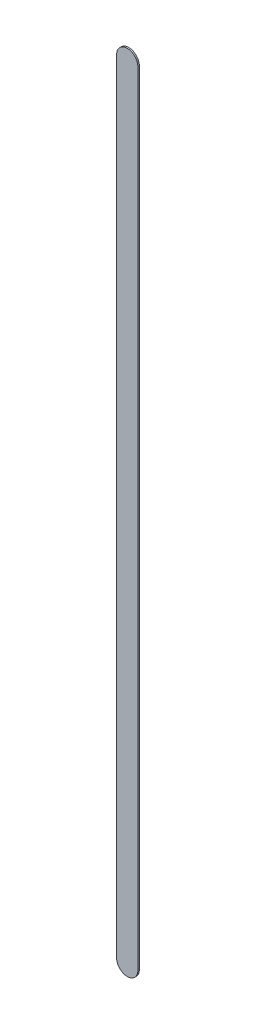
ISO-10303-21;
HEADER;
FILE_DESCRIPTION(('STEP AP214'),'2;1');
FILE_NAME('part.step','',(''),(''),'','','');
FILE_SCHEMA(('AUTOMOTIVE_DESIGN { 1 0 10303 214 1 1 1 1 }'));
ENDSEC;
DATA;
#1=APPLICATION_CONTEXT('core data for automotive mechanical design processes');
#2=APPLICATION_PROTOCOL_DEFINITION('international standard','automotive_design',2000,#1);
#3=PRODUCT_CONTEXT('',#1,'mechanical');
#4=PRODUCT('Part','Part','',(#3));
#5=PRODUCT_RELATED_PRODUCT_CATEGORY('part','',(#4));
#6=PRODUCT_DEFINITION_FORMATION('','',#4);
#7=PRODUCT_DEFINITION_CONTEXT('part definition',#1,'design');
#8=PRODUCT_DEFINITION('design','',#6,#7);
#9=PRODUCT_DEFINITION_SHAPE('','',#8);
#10=(LENGTH_UNIT() NAMED_UNIT(*) SI_UNIT(.MILLI.,.METRE.));
#11=(NAMED_UNIT(*) PLANE_ANGLE_UNIT() SI_UNIT($,.RADIAN.));
#12=(NAMED_UNIT(*) SI_UNIT($,.STERADIAN.) SOLID_ANGLE_UNIT());
#13=UNCERTAINTY_MEASURE_WITH_UNIT(LENGTH_MEASURE(1.E-05),#10,'distance_accuracy_value','');
#14=(GEOMETRIC_REPRESENTATION_CONTEXT(3) GLOBAL_UNCERTAINTY_ASSIGNED_CONTEXT((#13)) GLOBAL_UNIT_ASSIGNED_CONTEXT((#10,
#11,#12)) REPRESENTATION_CONTEXT('',''));
#15=CARTESIAN_POINT('',(0.,0.,0.));
#16=DIRECTION('',(0.,0.,1.));
#17=DIRECTION('',(1.,0.,0.));
#18=AXIS2_PLACEMENT_3D('',#15,#16,#17);
#19=CARTESIAN_POINT('',(63.9528947,82.2634372,0.));
#20=DIRECTION('',(-1.,0.,0.));
#21=DIRECTION('',(0.,1.,0.));
#22=AXIS2_PLACEMENT_3D('',#19,#20,#21);
#23=PLANE('',#22);
#24=DIRECTION('',(0.,1.,0.));
#25=VECTOR('',#24,1.);
#26=CARTESIAN_POINT('',(63.9528947,82.2634372,0.03556));
#27=LINE('',#26,#25);
#28=CARTESIAN_POINT('',(63.9528947,82.2634372,0.03556));
#29=VERTEX_POINT('',#28);
#30=CARTESIAN_POINT('',(63.9528947,100.6970808,0.03556));
#31=VERTEX_POINT('',#30);
#32=EDGE_CURVE('E11',#29,#31,#27,.T.);
#33=ORIENTED_EDGE('',*,*,#32,.F.);
#34=DIRECTION('',(0.,0.,1.));
#35=VECTOR('',#34,1.);
#36=CARTESIAN_POINT('',(63.9528947,82.2634372,0.));
#37=LINE('',#36,#35);
#38=CARTESIAN_POINT('',(63.9528947,82.2634372,0.));
#39=VERTEX_POINT('',#38);
#40=EDGE_CURVE('E24',#39,#29,#37,.T.);
#41=ORIENTED_EDGE('',*,*,#40,.F.);
#42=DIRECTION('',(0.,1.,0.));
#43=VECTOR('',#42,1.);
#44=CARTESIAN_POINT('',(63.9528947,82.2634372,0.));
#45=LINE('',#44,#43);
#46=CARTESIAN_POINT('',(63.9528947,100.6970808,0.));
#47=VERTEX_POINT('',#46);
#48=EDGE_CURVE('E75',#39,#47,#45,.T.);
#49=ORIENTED_EDGE('',*,*,#48,.T.);
#50=DIRECTION('',(0.,0.,1.));
#51=VECTOR('',#50,1.);
#52=CARTESIAN_POINT('',(63.9528947,100.6970808,0.));
#53=LINE('',#52,#51);
#54=EDGE_CURVE('E37',#47,#31,#53,.T.);
#55=ORIENTED_EDGE('',*,*,#54,.T.);
#56=EDGE_LOOP('',(#33,#41,#49,#55));
#57=FACE_BOUND('',#56,.T.);
#58=ADVANCED_FACE('F17',(#57),#23,.F.);
#59=CARTESIAN_POINT('',(63.7028952,100.6970808,0.));
#60=DIRECTION('',(0.,0.,-1.));
#61=DIRECTION('',(1.,0.,0.));
#62=AXIS2_PLACEMENT_3D('',#59,#60,#61);
#63=CYLINDRICAL_SURFACE('',#62,0.249999500000001);
#64=CARTESIAN_POINT('',(63.7028952,100.6970808,0.03556));
#65=DIRECTION('',(0.,0.,1.));
#66=DIRECTION('',(1.,0.,0.));
#67=AXIS2_PLACEMENT_3D('',#64,#65,#66);
#68=CIRCLE('',#67,0.249999500000001);
#69=CARTESIAN_POINT('',(63.4528957,100.6970808,0.03556));
#70=VERTEX_POINT('',#69);
#71=EDGE_CURVE('E83',#31,#70,#68,.T.);
#72=ORIENTED_EDGE('',*,*,#71,.F.);
#73=ORIENTED_EDGE('',*,*,#54,.F.);
#74=CARTESIAN_POINT('',(63.7028952,100.6970808,0.));
#75=DIRECTION('',(0.,0.,1.));
#76=DIRECTION('',(1.,0.,0.));
#77=AXIS2_PLACEMENT_3D('',#74,#75,#76);
#78=CIRCLE('',#77,0.249999500000001);
#79=CARTESIAN_POINT('',(63.4528957,100.6970808,0.));
#80=VERTEX_POINT('',#79);
#81=EDGE_CURVE('E81',#47,#80,#78,.T.);
#82=ORIENTED_EDGE('',*,*,#81,.T.);
#83=DIRECTION('',(0.,0.,1.));
#84=VECTOR('',#83,1.);
#85=CARTESIAN_POINT('',(63.4528957,100.6970808,0.));
#86=LINE('',#85,#84);
#87=EDGE_CURVE('E67',#80,#70,#86,.T.);
#88=ORIENTED_EDGE('',*,*,#87,.T.);
#89=EDGE_LOOP('',(#72,#73,#82,#88));
#90=FACE_BOUND('',#89,.T.);
#91=ADVANCED_FACE('F89',(#90),#63,.T.);
#92=CARTESIAN_POINT('',(63.4528957,100.6970808,0.));
#93=DIRECTION('',(1.,0.,0.));
#94=DIRECTION('',(0.,-1.,0.));
#95=AXIS2_PLACEMENT_3D('',#92,#93,#94);
#96=PLANE('',#95);
#97=DIRECTION('',(0.,-1.,0.));
#98=VECTOR('',#97,1.);
#99=CARTESIAN_POINT('',(63.4528957,100.6970808,0.03556));
#100=LINE('',#99,#98);
#101=CARTESIAN_POINT('',(63.4528957,82.2634372,0.03556));
#102=VERTEX_POINT('',#101);
#103=EDGE_CURVE('E71',#70,#102,#100,.T.);
#104=ORIENTED_EDGE('',*,*,#103,.F.);
#105=ORIENTED_EDGE('',*,*,#87,.F.);
#106=DIRECTION('',(0.,-1.,0.));
#107=VECTOR('',#106,1.);
#108=CARTESIAN_POINT('',(63.4528957,100.6970808,0.));
#109=LINE('',#108,#107);
#110=CARTESIAN_POINT('',(63.4528957,82.2634372,0.));
#111=VERTEX_POINT('',#110);
#112=EDGE_CURVE('E63',#80,#111,#109,.T.);
#113=ORIENTED_EDGE('',*,*,#112,.T.);
#114=DIRECTION('',(0.,0.,1.));
#115=VECTOR('',#114,1.);
#116=CARTESIAN_POINT('',(63.4528957,82.2634372,0.));
#117=LINE('',#116,#115);
#118=EDGE_CURVE('E53',#111,#102,#117,.T.);
#119=ORIENTED_EDGE('',*,*,#118,.T.);
#120=EDGE_LOOP('',(#104,#105,#113,#119));
#121=FACE_BOUND('',#120,.T.);
#122=ADVANCED_FACE('F66',(#121),#96,.F.);
#123=CARTESIAN_POINT('',(63.7028952,82.2634372,0.));
#124=DIRECTION('',(0.,0.,-1.));
#125=DIRECTION('',(-1.,0.,0.));
#126=AXIS2_PLACEMENT_3D('',#123,#124,#125);
#127=CYLINDRICAL_SURFACE('',#126,0.249999500000001);
#128=CARTESIAN_POINT('',(63.7028952,82.2634372,0.03556));
#129=DIRECTION('',(0.,0.,1.));
#130=DIRECTION('',(-1.,0.,0.));
#131=AXIS2_PLACEMENT_3D('',#128,#129,#130);
#132=CIRCLE('',#131,0.249999500000001);
#133=EDGE_CURVE('E59',#102,#29,#132,.T.);
#134=ORIENTED_EDGE('',*,*,#133,.F.);
#135=ORIENTED_EDGE('',*,*,#118,.F.);
#136=CARTESIAN_POINT('',(63.7028952,82.2634372,0.));
#137=DIRECTION('',(0.,0.,1.));
#138=DIRECTION('',(-1.,0.,0.));
#139=AXIS2_PLACEMENT_3D('',#136,#137,#138);
#140=CIRCLE('',#139,0.249999500000001);
#141=EDGE_CURVE('E57',#111,#39,#140,.T.);
#142=ORIENTED_EDGE('',*,*,#141,.T.);
#143=ORIENTED_EDGE('',*,*,#40,.T.);
#144=EDGE_LOOP('',(#134,#135,#142,#143));
#145=FACE_BOUND('',#144,.T.);
#146=ADVANCED_FACE('F55',(#145),#127,.T.);
#147=CARTESIAN_POINT('',(63.9528947,82.2634372,0.));
#148=DIRECTION('',(0.,0.,-1.));
#149=DIRECTION('',(-1.,0.,0.));
#150=AXIS2_PLACEMENT_3D('',#147,#148,#149);
#151=PLANE('',#150);
#152=ORIENTED_EDGE('',*,*,#141,.F.);
#153=ORIENTED_EDGE('',*,*,#112,.F.);
#154=ORIENTED_EDGE('',*,*,#81,.F.);
#155=ORIENTED_EDGE('',*,*,#48,.F.);
#156=EDGE_LOOP('',(#152,#153,#154,#155));
#157=FACE_BOUND('',#156,.T.);
#158=ADVANCED_FACE('F74',(#157),#151,.T.);
#159=CARTESIAN_POINT('',(63.9528947,82.2634372,0.03556));
#160=DIRECTION('',(0.,0.,-1.));
#161=DIRECTION('',(-1.,0.,0.));
#162=AXIS2_PLACEMENT_3D('',#159,#160,#161);
#163=PLANE('',#162);
#164=ORIENTED_EDGE('',*,*,#32,.T.);
#165=ORIENTED_EDGE('',*,*,#71,.T.);
#166=ORIENTED_EDGE('',*,*,#103,.T.);
#167=ORIENTED_EDGE('',*,*,#133,.T.);
#168=EDGE_LOOP('',(#164,#165,#166,#167));
#169=FACE_BOUND('',#168,.T.);
#170=ADVANCED_FACE('F91',(#169),#163,.F.);
#171=CLOSED_SHELL('',(#58,#91,#122,#146,#158,#170));
#172=MANIFOLD_SOLID_BREP('B1',#171);
#173=ADVANCED_BREP_SHAPE_REPRESENTATION('',(#18,#172),#14);
#174=SHAPE_DEFINITION_REPRESENTATION(#9,#173);
ENDSEC;
END-ISO-10303-21;
